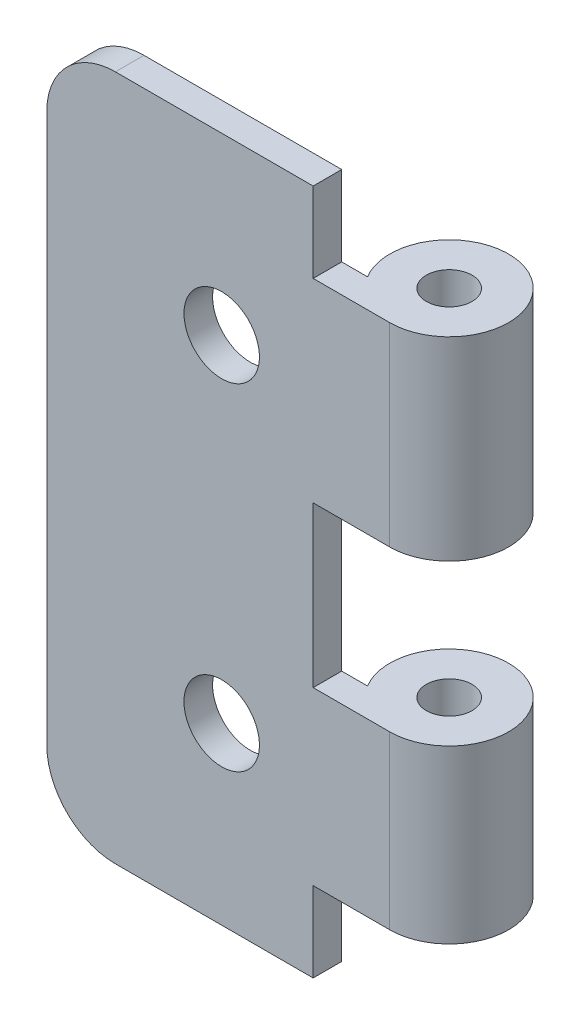
ISO-10303-21;
HEADER;
FILE_DESCRIPTION(('STEP AP214'),'2;1');
FILE_NAME('part.step','',(''),(''),'','','');
FILE_SCHEMA(('AUTOMOTIVE_DESIGN { 1 0 10303 214 1 1 1 1 }'));
ENDSEC;
DATA;
#1=APPLICATION_CONTEXT('core data for automotive mechanical design processes');
#2=APPLICATION_PROTOCOL_DEFINITION('international standard','automotive_design',2000,#1);
#3=PRODUCT_CONTEXT('',#1,'mechanical');
#4=PRODUCT('Part','Part','',(#3));
#5=PRODUCT_RELATED_PRODUCT_CATEGORY('part','',(#4));
#6=PRODUCT_DEFINITION_FORMATION('','',#4);
#7=PRODUCT_DEFINITION_CONTEXT('part definition',#1,'design');
#8=PRODUCT_DEFINITION('design','',#6,#7);
#9=PRODUCT_DEFINITION_SHAPE('','',#8);
#10=(LENGTH_UNIT() NAMED_UNIT(*) SI_UNIT(.MILLI.,.METRE.));
#11=(NAMED_UNIT(*) PLANE_ANGLE_UNIT() SI_UNIT($,.RADIAN.));
#12=(NAMED_UNIT(*) SI_UNIT($,.STERADIAN.) SOLID_ANGLE_UNIT());
#13=UNCERTAINTY_MEASURE_WITH_UNIT(LENGTH_MEASURE(1.E-05),#10,'distance_accuracy_value','');
#14=(GEOMETRIC_REPRESENTATION_CONTEXT(3) GLOBAL_UNCERTAINTY_ASSIGNED_CONTEXT((#13)) GLOBAL_UNIT_ASSIGNED_CONTEXT((#10,
#11,#12)) REPRESENTATION_CONTEXT('',''));
#15=CARTESIAN_POINT('',(0.,0.,0.));
#16=DIRECTION('',(0.,0.,1.));
#17=DIRECTION('',(1.,0.,0.));
#18=AXIS2_PLACEMENT_3D('',#15,#16,#17);
#19=CARTESIAN_POINT('',(7.62,68.58,-2.6658271083128));
#20=DIRECTION('',(0.,0.,1.));
#21=DIRECTION('',(1.,0.,0.));
#22=AXIS2_PLACEMENT_3D('',#19,#20,#21);
#23=CYLINDRICAL_SURFACE('',#22,7.62);
#24=DIRECTION('',(0.,0.,1.));
#25=VECTOR('',#24,1.);
#26=CARTESIAN_POINT('',(7.62,76.2,-2.6658271083128));
#27=LINE('',#26,#25);
#28=CARTESIAN_POINT('',(7.62,76.2,-3.175));
#29=VERTEX_POINT('',#28);
#30=CARTESIAN_POINT('',(7.62,76.2,0.));
#31=VERTEX_POINT('',#30);
#32=EDGE_CURVE('E188',#29,#31,#27,.T.);
#33=ORIENTED_EDGE('',*,*,#32,.F.);
#34=CARTESIAN_POINT('',(7.62,68.58,-3.175));
#35=DIRECTION('',(0.,0.,-1.));
#36=DIRECTION('',(-1.,0.,0.));
#37=AXIS2_PLACEMENT_3D('',#34,#35,#36);
#38=CIRCLE('',#37,7.62);
#39=CARTESIAN_POINT('',(0.,68.58,-3.175));
#40=VERTEX_POINT('',#39);
#41=EDGE_CURVE('E42',#40,#29,#38,.T.);
#42=ORIENTED_EDGE('',*,*,#41,.F.);
#43=DIRECTION('',(0.,0.,1.));
#44=VECTOR('',#43,1.);
#45=CARTESIAN_POINT('',(0.,68.58,-2.6658271083128));
#46=LINE('',#45,#44);
#47=CARTESIAN_POINT('',(0.,68.58,0.));
#48=VERTEX_POINT('',#47);
#49=EDGE_CURVE('E191',#48,#40,#46,.F.);
#50=ORIENTED_EDGE('',*,*,#49,.F.);
#51=CARTESIAN_POINT('',(7.62,68.58,0.));
#52=DIRECTION('',(0.,0.,-1.));
#53=DIRECTION('',(-1.,0.,0.));
#54=AXIS2_PLACEMENT_3D('',#51,#52,#53);
#55=CIRCLE('',#54,7.62);
#56=EDGE_CURVE('E11',#31,#48,#55,.F.);
#57=ORIENTED_EDGE('',*,*,#56,.F.);
#58=EDGE_LOOP('',(#33,#42,#50,#57));
#59=FACE_BOUND('',#58,.T.);
#60=ADVANCED_FACE('F35',(#59),#23,.T.);
#61=CARTESIAN_POINT('',(7.62,7.62,-2.6658271083128));
#62=DIRECTION('',(0.,0.,-1.));
#63=DIRECTION('',(-1.,0.,0.));
#64=AXIS2_PLACEMENT_3D('',#61,#62,#63);
#65=CYLINDRICAL_SURFACE('',#64,7.62);
#66=DIRECTION('',(0.,0.,1.));
#67=VECTOR('',#66,1.);
#68=CARTESIAN_POINT('',(0.,7.62,-2.6658271083128));
#69=LINE('',#68,#67);
#70=CARTESIAN_POINT('',(0.,7.62000000000002,-3.175));
#71=VERTEX_POINT('',#70);
#72=CARTESIAN_POINT('',(0.,7.62000000000002,0.));
#73=VERTEX_POINT('',#72);
#74=EDGE_CURVE('E169',#71,#73,#69,.T.);
#75=ORIENTED_EDGE('',*,*,#74,.F.);
#76=CARTESIAN_POINT('',(7.62,7.62,-3.175));
#77=DIRECTION('',(0.,0.,-1.));
#78=DIRECTION('',(-1.,0.,0.));
#79=AXIS2_PLACEMENT_3D('',#76,#77,#78);
#80=CIRCLE('',#79,7.62);
#81=CARTESIAN_POINT('',(7.62,0.,-3.175));
#82=VERTEX_POINT('',#81);
#83=EDGE_CURVE('E183',#82,#71,#80,.T.);
#84=ORIENTED_EDGE('',*,*,#83,.F.);
#85=DIRECTION('',(0.,0.,1.));
#86=VECTOR('',#85,1.);
#87=CARTESIAN_POINT('',(7.62,0.,-2.6658271083128));
#88=LINE('',#87,#86);
#89=CARTESIAN_POINT('',(7.62,0.,0.));
#90=VERTEX_POINT('',#89);
#91=EDGE_CURVE('E180',#90,#82,#88,.F.);
#92=ORIENTED_EDGE('',*,*,#91,.F.);
#93=CARTESIAN_POINT('',(7.62,7.62,0.));
#94=DIRECTION('',(0.,0.,-1.));
#95=DIRECTION('',(-1.,0.,0.));
#96=AXIS2_PLACEMENT_3D('',#93,#94,#95);
#97=CIRCLE('',#96,7.62);
#98=EDGE_CURVE('E186',#73,#90,#97,.F.);
#99=ORIENTED_EDGE('',*,*,#98,.F.);
#100=EDGE_LOOP('',(#75,#84,#92,#99));
#101=FACE_BOUND('',#100,.T.);
#102=ADVANCED_FACE('F264',(#101),#65,.T.);
#103=CARTESIAN_POINT('',(-13.8136565855366,76.2,0.));
#104=DIRECTION('',(0.,0.,-1.));
#105=DIRECTION('',(-1.,0.,0.));
#106=AXIS2_PLACEMENT_3D('',#103,#104,#105);
#107=PLANE('',#106);
#108=CARTESIAN_POINT('',(19.431,56.769,0.));
#109=DIRECTION('',(0.,0.,-1.));
#110=DIRECTION('',(-1.,0.,0.));
#111=AXIS2_PLACEMENT_3D('',#108,#109,#110);
#112=CIRCLE('',#111,4.191);
#113=CARTESIAN_POINT('',(15.24,56.769,0.));
#114=VERTEX_POINT('',#113);
#115=EDGE_CURVE('E207',#114,#114,#112,.T.);
#116=ORIENTED_EDGE('',*,*,#115,.T.);
#117=EDGE_LOOP('',(#116));
#118=FACE_BOUND('',#117,.T.);
#119=CARTESIAN_POINT('',(19.431,19.431,0.));
#120=DIRECTION('',(0.,0.,-1.));
#121=DIRECTION('',(-1.,0.,0.));
#122=AXIS2_PLACEMENT_3D('',#119,#120,#121);
#123=CIRCLE('',#122,4.191);
#124=CARTESIAN_POINT('',(15.24,19.431,0.));
#125=VERTEX_POINT('',#124);
#126=EDGE_CURVE('E234',#125,#125,#123,.T.);
#127=ORIENTED_EDGE('',*,*,#126,.T.);
#128=EDGE_LOOP('',(#127));
#129=FACE_BOUND('',#128,.T.);
#130=DIRECTION('',(1.,0.,0.));
#131=VECTOR('',#130,1.);
#132=CARTESIAN_POINT('',(-13.8136565855366,76.2,0.));
#133=LINE('',#132,#131);
#134=CARTESIAN_POINT('',(29.591,76.2,0.));
#135=VERTEX_POINT('',#134);
#136=EDGE_CURVE('E199',#31,#135,#133,.T.);
#137=ORIENTED_EDGE('',*,*,#136,.F.);
#138=ORIENTED_EDGE('',*,*,#56,.T.);
#139=DIRECTION('',(0.,-1.,0.));
#140=VECTOR('',#139,1.);
#141=CARTESIAN_POINT('',(0.,76.2,0.));
#142=LINE('',#141,#140);
#143=EDGE_CURVE('E198',#48,#73,#142,.T.);
#144=ORIENTED_EDGE('',*,*,#143,.T.);
#145=ORIENTED_EDGE('',*,*,#98,.T.);
#146=DIRECTION('',(1.,0.,0.));
#147=VECTOR('',#146,1.);
#148=CARTESIAN_POINT('',(-13.8136565855366,0.,0.));
#149=LINE('',#148,#147);
#150=CARTESIAN_POINT('',(29.591,0.,0.));
#151=VERTEX_POINT('',#150);
#152=EDGE_CURVE('E205',#90,#151,#149,.T.);
#153=ORIENTED_EDGE('',*,*,#152,.T.);
#154=DIRECTION('',(0.,-1.,0.));
#155=VECTOR('',#154,1.);
#156=CARTESIAN_POINT('',(29.591,8.89,0.));
#157=LINE('',#156,#155);
#158=CARTESIAN_POINT('',(29.591,8.89,0.));
#159=VERTEX_POINT('',#158);
#160=EDGE_CURVE('E224',#159,#151,#157,.T.);
#161=ORIENTED_EDGE('',*,*,#160,.F.);
#162=DIRECTION('',(1.,0.,0.));
#163=VECTOR('',#162,1.);
#164=CARTESIAN_POINT('',(-13.8136565855366,8.89,0.));
#165=LINE('',#164,#163);
#166=CARTESIAN_POINT('',(38.1,8.89,0.));
#167=VERTEX_POINT('',#166);
#168=EDGE_CURVE('E225',#159,#167,#165,.T.);
#169=ORIENTED_EDGE('',*,*,#168,.T.);
#170=DIRECTION('',(0.,-1.,0.));
#171=VECTOR('',#170,1.);
#172=CARTESIAN_POINT('',(38.1,76.2,0.));
#173=LINE('',#172,#171);
#174=CARTESIAN_POINT('',(38.1,27.94,0.));
#175=VERTEX_POINT('',#174);
#176=EDGE_CURVE('E160',#175,#167,#173,.T.);
#177=ORIENTED_EDGE('',*,*,#176,.F.);
#178=DIRECTION('',(1.,0.,0.));
#179=VECTOR('',#178,1.);
#180=CARTESIAN_POINT('',(-13.8136565855366,27.94,0.));
#181=LINE('',#180,#179);
#182=CARTESIAN_POINT('',(29.591,27.94,0.));
#183=VERTEX_POINT('',#182);
#184=EDGE_CURVE('E327',#183,#175,#181,.T.);
#185=ORIENTED_EDGE('',*,*,#184,.F.);
#186=DIRECTION('',(0.,-1.,0.));
#187=VECTOR('',#186,1.);
#188=CARTESIAN_POINT('',(29.591,45.72,0.));
#189=LINE('',#188,#187);
#190=CARTESIAN_POINT('',(29.591,45.72,0.));
#191=VERTEX_POINT('',#190);
#192=EDGE_CURVE('E334',#191,#183,#189,.T.);
#193=ORIENTED_EDGE('',*,*,#192,.F.);
#194=DIRECTION('',(1.,0.,0.));
#195=VECTOR('',#194,1.);
#196=CARTESIAN_POINT('',(-13.8136565855366,45.72,0.));
#197=LINE('',#196,#195);
#198=CARTESIAN_POINT('',(38.1,45.72,0.));
#199=VERTEX_POINT('',#198);
#200=EDGE_CURVE('E332',#191,#199,#197,.T.);
#201=ORIENTED_EDGE('',*,*,#200,.T.);
#202=CARTESIAN_POINT('',(38.1,67.31,0.));
#203=VERTEX_POINT('',#202);
#204=EDGE_CURVE('E163',#203,#199,#173,.T.);
#205=ORIENTED_EDGE('',*,*,#204,.F.);
#206=DIRECTION('',(1.,0.,0.));
#207=VECTOR('',#206,1.);
#208=CARTESIAN_POINT('',(-13.8136565855366,67.31,0.));
#209=LINE('',#208,#207);
#210=CARTESIAN_POINT('',(29.591,67.31,0.));
#211=VERTEX_POINT('',#210);
#212=EDGE_CURVE('E140',#211,#203,#209,.T.);
#213=ORIENTED_EDGE('',*,*,#212,.F.);
#214=DIRECTION('',(0.,1.,0.));
#215=VECTOR('',#214,1.);
#216=CARTESIAN_POINT('',(29.591,67.31,0.));
#217=LINE('',#216,#215);
#218=EDGE_CURVE('E177',#211,#135,#217,.T.);
#219=ORIENTED_EDGE('',*,*,#218,.T.);
#220=EDGE_LOOP('',(#137,#138,#144,#145,#153,#161,#169,#177,#185,#193,#201,#205,#213,#219));
#221=FACE_BOUND('',#220,.T.);
#222=ADVANCED_FACE('F246',(#118,#129,#221),#107,.F.);
#223=CARTESIAN_POINT('',(38.1,76.2,-6.604));
#224=DIRECTION('',(0.,-1.,0.));
#225=DIRECTION('',(0.,0.,-1.));
#226=AXIS2_PLACEMENT_3D('',#223,#224,#225);
#227=CYLINDRICAL_SURFACE('',#226,6.604);
#228=CARTESIAN_POINT('',(38.1,67.31,-6.604));
#229=DIRECTION('',(0.,1.,0.));
#230=DIRECTION('',(0.,0.,1.));
#231=AXIS2_PLACEMENT_3D('',#228,#229,#230);
#232=CIRCLE('',#231,6.604);
#233=CARTESIAN_POINT('',(32.4559965450046,67.31,-3.175));
#234=VERTEX_POINT('',#233);
#235=EDGE_CURVE('E132',#203,#234,#232,.T.);
#236=ORIENTED_EDGE('',*,*,#235,.F.);
#237=ORIENTED_EDGE('',*,*,#204,.T.);
#238=CARTESIAN_POINT('',(38.1,45.72,-6.604));
#239=DIRECTION('',(0.,1.,0.));
#240=DIRECTION('',(0.,0.,1.));
#241=AXIS2_PLACEMENT_3D('',#238,#239,#240);
#242=CIRCLE('',#241,6.604);
#243=CARTESIAN_POINT('',(32.4559965450046,45.72,-3.175));
#244=VERTEX_POINT('',#243);
#245=EDGE_CURVE('E159',#199,#244,#242,.T.);
#246=ORIENTED_EDGE('',*,*,#245,.T.);
#247=DIRECTION('',(0.,-1.,0.));
#248=VECTOR('',#247,1.);
#249=CARTESIAN_POINT('',(32.4559965450046,76.2,-3.175));
#250=LINE('',#249,#248);
#251=EDGE_CURVE('E150',#234,#244,#250,.T.);
#252=ORIENTED_EDGE('',*,*,#251,.F.);
#253=EDGE_LOOP('',(#236,#237,#246,#252));
#254=FACE_BOUND('',#253,.T.);
#255=ADVANCED_FACE('F157',(#254),#227,.T.);
#256=CARTESIAN_POINT('',(-13.8136565855366,76.2,-3.175));
#257=DIRECTION('',(0.,0.,-1.));
#258=DIRECTION('',(-1.,0.,0.));
#259=AXIS2_PLACEMENT_3D('',#256,#257,#258);
#260=PLANE('',#259);
#261=CARTESIAN_POINT('',(19.431,56.769,-3.175));
#262=DIRECTION('',(0.,0.,-1.));
#263=DIRECTION('',(-1.,0.,0.));
#264=AXIS2_PLACEMENT_3D('',#261,#262,#263);
#265=CIRCLE('',#264,4.191);
#266=CARTESIAN_POINT('',(15.24,56.769,-3.175));
#267=VERTEX_POINT('',#266);
#268=EDGE_CURVE('E241',#267,#267,#265,.T.);
#269=ORIENTED_EDGE('',*,*,#268,.F.);
#270=EDGE_LOOP('',(#269));
#271=FACE_BOUND('',#270,.T.);
#272=CARTESIAN_POINT('',(19.431,19.431,-3.175));
#273=DIRECTION('',(0.,0.,-1.));
#274=DIRECTION('',(-1.,0.,0.));
#275=AXIS2_PLACEMENT_3D('',#272,#273,#274);
#276=CIRCLE('',#275,4.191);
#277=CARTESIAN_POINT('',(15.24,19.431,-3.175));
#278=VERTEX_POINT('',#277);
#279=EDGE_CURVE('E231',#278,#278,#276,.T.);
#280=ORIENTED_EDGE('',*,*,#279,.F.);
#281=EDGE_LOOP('',(#280));
#282=FACE_BOUND('',#281,.T.);
#283=DIRECTION('',(0.,-1.,0.));
#284=VECTOR('',#283,1.);
#285=CARTESIAN_POINT('',(0.,76.2,-3.175));
#286=LINE('',#285,#284);
#287=EDGE_CURVE('E165',#40,#71,#286,.T.);
#288=ORIENTED_EDGE('',*,*,#287,.F.);
#289=ORIENTED_EDGE('',*,*,#41,.T.);
#290=DIRECTION('',(1.,0.,0.));
#291=VECTOR('',#290,1.);
#292=CARTESIAN_POINT('',(-13.8136565855366,76.2,-3.175));
#293=LINE('',#292,#291);
#294=CARTESIAN_POINT('',(29.591,76.2,-3.175));
#295=VERTEX_POINT('',#294);
#296=EDGE_CURVE('E193',#29,#295,#293,.T.);
#297=ORIENTED_EDGE('',*,*,#296,.T.);
#298=DIRECTION('',(0.,1.,0.));
#299=VECTOR('',#298,1.);
#300=CARTESIAN_POINT('',(29.591,67.31,-3.175));
#301=LINE('',#300,#299);
#302=CARTESIAN_POINT('',(29.591,67.31,-3.175));
#303=VERTEX_POINT('',#302);
#304=EDGE_CURVE('E153',#303,#295,#301,.T.);
#305=ORIENTED_EDGE('',*,*,#304,.F.);
#306=DIRECTION('',(1.,0.,0.));
#307=VECTOR('',#306,1.);
#308=CARTESIAN_POINT('',(-13.8136565855366,67.31,-3.175));
#309=LINE('',#308,#307);
#310=EDGE_CURVE('E137',#303,#234,#309,.T.);
#311=ORIENTED_EDGE('',*,*,#310,.T.);
#312=ORIENTED_EDGE('',*,*,#251,.T.);
#313=DIRECTION('',(1.,0.,0.));
#314=VECTOR('',#313,1.);
#315=CARTESIAN_POINT('',(-13.8136565855366,45.72,-3.175));
#316=LINE('',#315,#314);
#317=CARTESIAN_POINT('',(29.591,45.72,-3.175));
#318=VERTEX_POINT('',#317);
#319=EDGE_CURVE('E326',#318,#244,#316,.T.);
#320=ORIENTED_EDGE('',*,*,#319,.F.);
#321=DIRECTION('',(0.,-1.,0.));
#322=VECTOR('',#321,1.);
#323=CARTESIAN_POINT('',(29.591,45.72,-3.175));
#324=LINE('',#323,#322);
#325=CARTESIAN_POINT('',(29.591,27.94,-3.175));
#326=VERTEX_POINT('',#325);
#327=EDGE_CURVE('E226',#318,#326,#324,.T.);
#328=ORIENTED_EDGE('',*,*,#327,.T.);
#329=DIRECTION('',(1.,0.,0.));
#330=VECTOR('',#329,1.);
#331=CARTESIAN_POINT('',(-13.8136565855366,27.94,-3.175));
#332=LINE('',#331,#330);
#333=CARTESIAN_POINT('',(32.4559965450046,27.94,-3.175));
#334=VERTEX_POINT('',#333);
#335=EDGE_CURVE('E319',#326,#334,#332,.T.);
#336=ORIENTED_EDGE('',*,*,#335,.T.);
#337=CARTESIAN_POINT('',(32.4559965450046,8.89,-3.175));
#338=VERTEX_POINT('',#337);
#339=EDGE_CURVE('E161',#334,#338,#250,.T.);
#340=ORIENTED_EDGE('',*,*,#339,.T.);
#341=DIRECTION('',(1.,0.,0.));
#342=VECTOR('',#341,1.);
#343=CARTESIAN_POINT('',(-13.8136565855366,8.89,-3.175));
#344=LINE('',#343,#342);
#345=CARTESIAN_POINT('',(29.591,8.89,-3.175));
#346=VERTEX_POINT('',#345);
#347=EDGE_CURVE('E230',#346,#338,#344,.T.);
#348=ORIENTED_EDGE('',*,*,#347,.F.);
#349=DIRECTION('',(0.,-1.,0.));
#350=VECTOR('',#349,1.);
#351=CARTESIAN_POINT('',(29.591,8.89,-3.175));
#352=LINE('',#351,#350);
#353=CARTESIAN_POINT('',(29.591,0.,-3.175));
#354=VERTEX_POINT('',#353);
#355=EDGE_CURVE('E221',#346,#354,#352,.T.);
#356=ORIENTED_EDGE('',*,*,#355,.T.);
#357=DIRECTION('',(1.,0.,0.));
#358=VECTOR('',#357,1.);
#359=CARTESIAN_POINT('',(-13.8136565855366,0.,-3.175));
#360=LINE('',#359,#358);
#361=EDGE_CURVE('E201',#82,#354,#360,.T.);
#362=ORIENTED_EDGE('',*,*,#361,.F.);
#363=ORIENTED_EDGE('',*,*,#83,.T.);
#364=EDGE_LOOP('',(#288,#289,#297,#305,#311,#312,#320,#328,#336,#340,#348,#356,#362,#363));
#365=FACE_BOUND('',#364,.T.);
#366=ADVANCED_FACE('F148',(#271,#282,#365),#260,.T.);
#367=CARTESIAN_POINT('',(-13.8136565855366,76.2,-2.6658271083128));
#368=DIRECTION('',(0.,1.,0.));
#369=DIRECTION('',(0.,0.,1.));
#370=AXIS2_PLACEMENT_3D('',#367,#368,#369);
#371=PLANE('',#370);
#372=ORIENTED_EDGE('',*,*,#296,.F.);
#373=ORIENTED_EDGE('',*,*,#32,.T.);
#374=ORIENTED_EDGE('',*,*,#136,.T.);
#375=DIRECTION('',(0.,0.,-1.));
#376=VECTOR('',#375,1.);
#377=CARTESIAN_POINT('',(29.591,76.2,-2.6658271083128));
#378=LINE('',#377,#376);
#379=EDGE_CURVE('E144',#135,#295,#378,.T.);
#380=ORIENTED_EDGE('',*,*,#379,.T.);
#381=EDGE_LOOP('',(#372,#373,#374,#380));
#382=FACE_BOUND('',#381,.T.);
#383=ADVANCED_FACE('F196',(#382),#371,.T.);
#384=CARTESIAN_POINT('',(38.1,0.,-6.604));
#385=DIRECTION('',(0.,1.,0.));
#386=DIRECTION('',(0.,0.,1.));
#387=AXIS2_PLACEMENT_3D('',#384,#385,#386);
#388=CYLINDRICAL_SURFACE('',#387,2.54);
#389=CARTESIAN_POINT('',(38.1,45.72,-6.604));
#390=DIRECTION('',(0.,1.,0.));
#391=DIRECTION('',(0.,0.,1.));
#392=AXIS2_PLACEMENT_3D('',#389,#390,#391);
#393=CIRCLE('',#392,2.54);
#394=CARTESIAN_POINT('',(38.1,45.72,-4.064));
#395=VERTEX_POINT('',#394);
#396=EDGE_CURVE('E173',#395,#395,#393,.T.);
#397=CARTESIAN_POINT('',(38.1,67.31,-6.604));
#398=DIRECTION('',(0.,1.,0.));
#399=DIRECTION('',(0.,0.,1.));
#400=AXIS2_PLACEMENT_3D('',#397,#398,#399);
#401=CIRCLE('',#400,2.54);
#402=CARTESIAN_POINT('',(38.1,67.31,-4.064));
#403=VERTEX_POINT('',#402);
#404=EDGE_CURVE('E174',#403,#403,#401,.F.);
#405=CARTESIAN_POINT('',(38.1,45.72,-4.064));
#406=CARTESIAN_POINT('',(38.1,45.9448958333333,-4.064));
#407=CARTESIAN_POINT('',(38.1,46.1697916666667,-4.064));
#408=CARTESIAN_POINT('',(38.1,46.6195833333333,-4.064));
#409=CARTESIAN_POINT('',(38.1,46.8444791666667,-4.064));
#410=CARTESIAN_POINT('',(38.1,47.2942708333333,-4.064));
#411=CARTESIAN_POINT('',(38.1,47.5191666666667,-4.064));
#412=CARTESIAN_POINT('',(38.1,47.9689583333333,-4.064));
#413=CARTESIAN_POINT('',(38.1,48.1938541666667,-4.064));
#414=CARTESIAN_POINT('',(38.1,48.6436458333333,-4.064));
#415=CARTESIAN_POINT('',(38.1,48.8685416666667,-4.064));
#416=CARTESIAN_POINT('',(38.1,49.3183333333333,-4.064));
#417=CARTESIAN_POINT('',(38.1,49.5432291666667,-4.064));
#418=CARTESIAN_POINT('',(38.1,49.9930208333333,-4.064));
#419=CARTESIAN_POINT('',(38.1,50.2179166666667,-4.064));
#420=CARTESIAN_POINT('',(38.1,50.6677083333333,-4.064));
#421=CARTESIAN_POINT('',(38.1,50.8926041666667,-4.064));
#422=CARTESIAN_POINT('',(38.1,51.3423958333333,-4.064));
#423=CARTESIAN_POINT('',(38.1,51.5672916666667,-4.064));
#424=CARTESIAN_POINT('',(38.1,52.0170833333333,-4.064));
#425=CARTESIAN_POINT('',(38.1,52.2419791666667,-4.064));
#426=CARTESIAN_POINT('',(38.1,52.6917708333333,-4.064));
#427=CARTESIAN_POINT('',(38.1,52.9166666666667,-4.064));
#428=CARTESIAN_POINT('',(38.1,53.3664583333333,-4.064));
#429=CARTESIAN_POINT('',(38.1,53.5913541666667,-4.064));
#430=CARTESIAN_POINT('',(38.1,54.0411458333333,-4.064));
#431=CARTESIAN_POINT('',(38.1,54.2660416666667,-4.064));
#432=CARTESIAN_POINT('',(38.1,54.7158333333333,-4.064));
#433=CARTESIAN_POINT('',(38.1,54.9407291666667,-4.064));
#434=CARTESIAN_POINT('',(38.1,55.3905208333333,-4.064));
#435=CARTESIAN_POINT('',(38.1,55.6154166666667,-4.064));
#436=CARTESIAN_POINT('',(38.1,56.0652083333333,-4.064));
#437=CARTESIAN_POINT('',(38.1,56.2901041666667,-4.064));
#438=CARTESIAN_POINT('',(38.1,56.7398958333333,-4.064));
#439=CARTESIAN_POINT('',(38.1,56.9647916666667,-4.064));
#440=CARTESIAN_POINT('',(38.1,57.4145833333333,-4.064));
#441=CARTESIAN_POINT('',(38.1,57.6394791666667,-4.064));
#442=CARTESIAN_POINT('',(38.1,58.0892708333333,-4.064));
#443=CARTESIAN_POINT('',(38.1,58.3141666666667,-4.064));
#444=CARTESIAN_POINT('',(38.1,58.7639583333333,-4.064));
#445=CARTESIAN_POINT('',(38.1,58.9888541666667,-4.064));
#446=CARTESIAN_POINT('',(38.1,59.4386458333333,-4.064));
#447=CARTESIAN_POINT('',(38.1,59.6635416666667,-4.064));
#448=CARTESIAN_POINT('',(38.1,60.1133333333333,-4.064));
#449=CARTESIAN_POINT('',(38.1,60.3382291666667,-4.064));
#450=CARTESIAN_POINT('',(38.1,60.7880208333333,-4.064));
#451=CARTESIAN_POINT('',(38.1,61.0129166666667,-4.064));
#452=CARTESIAN_POINT('',(38.1,61.4627083333333,-4.064));
#453=CARTESIAN_POINT('',(38.1,61.6876041666667,-4.064));
#454=CARTESIAN_POINT('',(38.1,62.1373958333333,-4.064));
#455=CARTESIAN_POINT('',(38.1,62.3622916666667,-4.064));
#456=CARTESIAN_POINT('',(38.1,62.8120833333333,-4.064));
#457=CARTESIAN_POINT('',(38.1,63.0369791666667,-4.064));
#458=CARTESIAN_POINT('',(38.1,63.4867708333333,-4.064));
#459=CARTESIAN_POINT('',(38.1,63.7116666666667,-4.064));
#460=CARTESIAN_POINT('',(38.1,64.1614583333333,-4.064));
#461=CARTESIAN_POINT('',(38.1,64.3863541666667,-4.064));
#462=CARTESIAN_POINT('',(38.1,64.8361458333333,-4.064));
#463=CARTESIAN_POINT('',(38.1,65.0610416666667,-4.064));
#464=CARTESIAN_POINT('',(38.1,65.5108333333333,-4.064));
#465=CARTESIAN_POINT('',(38.1,65.7357291666667,-4.064));
#466=CARTESIAN_POINT('',(38.1,66.1855208333333,-4.064));
#467=CARTESIAN_POINT('',(38.1,66.4104166666667,-4.064));
#468=CARTESIAN_POINT('',(38.1,66.8602083333333,-4.064));
#469=CARTESIAN_POINT('',(38.1,67.0851041666667,-4.064));
#470=CARTESIAN_POINT('',(38.1,67.31,-4.064));
#471=B_SPLINE_CURVE_WITH_KNOTS('',3,(#405,#406,#407,#408,#409,#410,#411,#412,#413,#414,#415,
#416,#417,#418,#419,#420,#421,#422,#423,#424,#425,#426,#427,#428,#429,#430,#431,#432,#433,#434,
#435,#436,#437,#438,#439,#440,#441,#442,#443,#444,#445,#446,#447,#448,#449,#450,#451,#452,#453,
#454,#455,#456,#457,#458,#459,#460,#461,#462,#463,#464,#465,#466,#467,#468,#469,#470),
.UNSPECIFIED.,.F.,.F.,(4,2,2,2,2,2,2,2,2,2,2,2,2,2,2,2,2,2,2,2,2,2,2,2,2,2,2,2,2,2,2,2,4),(0.,
0.6746875,1.349375,2.0240625,2.69875,3.3734375,4.048125,4.72281250000001,5.3975,
6.07218750000001,6.74687500000001,7.42156250000001,8.09625000000001,8.77093750000001,
9.44562500000001,10.1203125,10.795,11.4696875,12.144375,12.8190625,13.49375,14.1684375,
14.843125,15.5178125,16.1925,16.8671875,17.541875,18.2165625,18.89125,19.5659375,20.240625,
20.9153125,21.59),.UNSPECIFIED.);
#472=EDGE_CURVE('BSEAM284',#395,#403,#471,.T.);
#473=ORIENTED_EDGE('',*,*,#396,.F.);
#474=ORIENTED_EDGE('',*,*,#404,.F.);
#475=ORIENTED_EDGE('',*,*,#472,.T.);
#476=ORIENTED_EDGE('',*,*,#472,.F.);
#477=EDGE_LOOP('',(#473,#475,#474,#476));
#478=FACE_BOUND('',#477,.T.);
#479=ADVANCED_FACE('F284',(#478),#388,.F.);
#480=CARTESIAN_POINT('',(38.1,27.94,-6.604));
#481=DIRECTION('',(0.,1.,0.));
#482=DIRECTION('',(0.,0.,1.));
#483=AXIS2_PLACEMENT_3D('',#480,#481,#482);
#484=CIRCLE('',#483,6.604);
#485=EDGE_CURVE('E317',#175,#334,#484,.T.);
#486=ORIENTED_EDGE('',*,*,#485,.F.);
#487=ORIENTED_EDGE('',*,*,#176,.T.);
#488=CARTESIAN_POINT('',(38.1,8.89,-6.604));
#489=DIRECTION('',(0.,1.,0.));
#490=DIRECTION('',(0.,0.,1.));
#491=AXIS2_PLACEMENT_3D('',#488,#489,#490);
#492=CIRCLE('',#491,6.604);
#493=EDGE_CURVE('E347',#167,#338,#492,.T.);
#494=ORIENTED_EDGE('',*,*,#493,.T.);
#495=ORIENTED_EDGE('',*,*,#339,.F.);
#496=EDGE_LOOP('',(#486,#487,#494,#495));
#497=FACE_BOUND('',#496,.T.);
#498=ADVANCED_FACE('F277',(#497),#227,.T.);
#499=CARTESIAN_POINT('',(0.,76.2,-2.6658271083128));
#500=DIRECTION('',(-1.,0.,0.));
#501=DIRECTION('',(0.,0.,1.));
#502=AXIS2_PLACEMENT_3D('',#499,#500,#501);
#503=PLANE('',#502);
#504=ORIENTED_EDGE('',*,*,#143,.F.);
#505=ORIENTED_EDGE('',*,*,#49,.T.);
#506=ORIENTED_EDGE('',*,*,#287,.T.);
#507=ORIENTED_EDGE('',*,*,#74,.T.);
#508=EDGE_LOOP('',(#504,#505,#506,#507));
#509=FACE_BOUND('',#508,.T.);
#510=ADVANCED_FACE('F260',(#509),#503,.T.);
#511=CARTESIAN_POINT('',(-13.8136565855366,0.,-2.6658271083128));
#512=DIRECTION('',(0.,1.,0.));
#513=DIRECTION('',(0.,0.,1.));
#514=AXIS2_PLACEMENT_3D('',#511,#512,#513);
#515=PLANE('',#514);
#516=ORIENTED_EDGE('',*,*,#152,.F.);
#517=ORIENTED_EDGE('',*,*,#91,.T.);
#518=ORIENTED_EDGE('',*,*,#361,.T.);
#519=DIRECTION('',(0.,0.,-1.));
#520=VECTOR('',#519,1.);
#521=CARTESIAN_POINT('',(29.591,0.,-2.6658271083128));
#522=LINE('',#521,#520);
#523=EDGE_CURVE('E214',#151,#354,#522,.T.);
#524=ORIENTED_EDGE('',*,*,#523,.F.);
#525=EDGE_LOOP('',(#516,#517,#518,#524));
#526=FACE_BOUND('',#525,.T.);
#527=ADVANCED_FACE('F213',(#526),#515,.F.);
#528=CARTESIAN_POINT('',(19.431,56.769,47.625));
#529=DIRECTION('',(0.,0.,-1.));
#530=DIRECTION('',(-1.,0.,0.));
#531=AXIS2_PLACEMENT_3D('',#528,#529,#530);
#532=CYLINDRICAL_SURFACE('',#531,4.191);
#533=ORIENTED_EDGE('',*,*,#268,.T.);
#534=EDGE_LOOP('',(#533));
#535=FACE_BOUND('',#534,.T.);
#536=ORIENTED_EDGE('',*,*,#115,.F.);
#537=EDGE_LOOP('',(#536));
#538=FACE_BOUND('',#537,.T.);
#539=ADVANCED_FACE('F249',(#535,#538),#532,.F.);
#540=CARTESIAN_POINT('',(19.431,19.431,47.625));
#541=DIRECTION('',(0.,0.,-1.));
#542=DIRECTION('',(-1.,0.,0.));
#543=AXIS2_PLACEMENT_3D('',#540,#541,#542);
#544=CYLINDRICAL_SURFACE('',#543,4.191);
#545=ORIENTED_EDGE('',*,*,#279,.T.);
#546=EDGE_LOOP('',(#545));
#547=FACE_BOUND('',#546,.T.);
#548=ORIENTED_EDGE('',*,*,#126,.F.);
#549=EDGE_LOOP('',(#548));
#550=FACE_BOUND('',#549,.T.);
#551=ADVANCED_FACE('F251',(#547,#550),#544,.F.);
#552=CARTESIAN_POINT('',(29.591,8.89,-2.6658271083128));
#553=DIRECTION('',(-1.,0.,0.));
#554=DIRECTION('',(0.,0.,1.));
#555=AXIS2_PLACEMENT_3D('',#552,#553,#554);
#556=PLANE('',#555);
#557=ORIENTED_EDGE('',*,*,#523,.T.);
#558=ORIENTED_EDGE('',*,*,#355,.F.);
#559=DIRECTION('',(0.,0.,-1.));
#560=VECTOR('',#559,1.);
#561=CARTESIAN_POINT('',(29.591,8.89,-2.6658271083128));
#562=LINE('',#561,#560);
#563=EDGE_CURVE('E236',#159,#346,#562,.T.);
#564=ORIENTED_EDGE('',*,*,#563,.F.);
#565=ORIENTED_EDGE('',*,*,#160,.T.);
#566=EDGE_LOOP('',(#557,#558,#564,#565));
#567=FACE_BOUND('',#566,.T.);
#568=ADVANCED_FACE('F219',(#567),#556,.F.);
#569=CARTESIAN_POINT('',(-13.8136565855366,8.89,-2.6658271083128));
#570=DIRECTION('',(0.,1.,0.));
#571=DIRECTION('',(0.,0.,1.));
#572=AXIS2_PLACEMENT_3D('',#569,#570,#571);
#573=PLANE('',#572);
#574=CARTESIAN_POINT('',(38.1,8.89,-6.604));
#575=DIRECTION('',(0.,1.,0.));
#576=DIRECTION('',(0.,0.,1.));
#577=AXIS2_PLACEMENT_3D('',#574,#575,#576);
#578=CIRCLE('',#577,2.54);
#579=CARTESIAN_POINT('',(38.1,8.89,-4.064));
#580=VERTEX_POINT('',#579);
#581=EDGE_CURVE('E315',#580,#580,#578,.T.);
#582=ORIENTED_EDGE('',*,*,#581,.T.);
#583=EDGE_LOOP('',(#582));
#584=FACE_BOUND('',#583,.T.);
#585=ORIENTED_EDGE('',*,*,#168,.F.);
#586=ORIENTED_EDGE('',*,*,#563,.T.);
#587=ORIENTED_EDGE('',*,*,#347,.T.);
#588=ORIENTED_EDGE('',*,*,#493,.F.);
#589=EDGE_LOOP('',(#585,#586,#587,#588));
#590=FACE_BOUND('',#589,.T.);
#591=ADVANCED_FACE('F352',(#584,#590),#573,.F.);
#592=CARTESIAN_POINT('',(29.591,45.72,-2.6658271083128));
#593=DIRECTION('',(-1.,0.,0.));
#594=DIRECTION('',(0.,0.,1.));
#595=AXIS2_PLACEMENT_3D('',#592,#593,#594);
#596=PLANE('',#595);
#597=DIRECTION('',(0.,0.,-1.));
#598=VECTOR('',#597,1.);
#599=CARTESIAN_POINT('',(29.591,27.94,-2.6658271083128));
#600=LINE('',#599,#598);
#601=EDGE_CURVE('E338',#183,#326,#600,.T.);
#602=ORIENTED_EDGE('',*,*,#601,.T.);
#603=ORIENTED_EDGE('',*,*,#327,.F.);
#604=DIRECTION('',(0.,0.,-1.));
#605=VECTOR('',#604,1.);
#606=CARTESIAN_POINT('',(29.591,45.72,-2.6658271083128));
#607=LINE('',#606,#605);
#608=EDGE_CURVE('E329',#191,#318,#607,.T.);
#609=ORIENTED_EDGE('',*,*,#608,.F.);
#610=ORIENTED_EDGE('',*,*,#192,.T.);
#611=EDGE_LOOP('',(#602,#603,#609,#610));
#612=FACE_BOUND('',#611,.T.);
#613=ADVANCED_FACE('F365',(#612),#596,.F.);
#614=CARTESIAN_POINT('',(-13.8136565855366,45.72,-2.6658271083128));
#615=DIRECTION('',(0.,1.,0.));
#616=DIRECTION('',(0.,0.,1.));
#617=AXIS2_PLACEMENT_3D('',#614,#615,#616);
#618=PLANE('',#617);
#619=ORIENTED_EDGE('',*,*,#396,.T.);
#620=EDGE_LOOP('',(#619));
#621=FACE_BOUND('',#620,.T.);
#622=ORIENTED_EDGE('',*,*,#245,.F.);
#623=ORIENTED_EDGE('',*,*,#200,.F.);
#624=ORIENTED_EDGE('',*,*,#608,.T.);
#625=ORIENTED_EDGE('',*,*,#319,.T.);
#626=EDGE_LOOP('',(#622,#623,#624,#625));
#627=FACE_BOUND('',#626,.T.);
#628=ADVANCED_FACE('F308',(#621,#627),#618,.F.);
#629=CARTESIAN_POINT('',(-13.8136565855366,27.94,-2.6658271083128));
#630=DIRECTION('',(0.,1.,0.));
#631=DIRECTION('',(0.,0.,1.));
#632=AXIS2_PLACEMENT_3D('',#629,#630,#631);
#633=PLANE('',#632);
#634=CARTESIAN_POINT('',(38.1,27.94,-6.604));
#635=DIRECTION('',(0.,1.,0.));
#636=DIRECTION('',(0.,0.,1.));
#637=AXIS2_PLACEMENT_3D('',#634,#635,#636);
#638=CIRCLE('',#637,2.54);
#639=CARTESIAN_POINT('',(38.1,27.94,-4.064));
#640=VERTEX_POINT('',#639);
#641=EDGE_CURVE('E170',#640,#640,#638,.T.);
#642=ORIENTED_EDGE('',*,*,#641,.F.);
#643=EDGE_LOOP('',(#642));
#644=FACE_BOUND('',#643,.T.);
#645=ORIENTED_EDGE('',*,*,#485,.T.);
#646=ORIENTED_EDGE('',*,*,#335,.F.);
#647=ORIENTED_EDGE('',*,*,#601,.F.);
#648=ORIENTED_EDGE('',*,*,#184,.T.);
#649=EDGE_LOOP('',(#645,#646,#647,#648));
#650=FACE_BOUND('',#649,.T.);
#651=ADVANCED_FACE('F300',(#644,#650),#633,.T.);
#652=CARTESIAN_POINT('',(38.1,27.94,-4.064));
#653=CARTESIAN_POINT('',(38.1,27.7415625,-4.064));
#654=CARTESIAN_POINT('',(38.1,27.543125,-4.064));
#655=CARTESIAN_POINT('',(38.1,27.14625,-4.064));
#656=CARTESIAN_POINT('',(38.1,26.9478125,-4.064));
#657=CARTESIAN_POINT('',(38.1,26.5509375,-4.064));
#658=CARTESIAN_POINT('',(38.1,26.3525,-4.064));
#659=CARTESIAN_POINT('',(38.1,25.955625,-4.064));
#660=CARTESIAN_POINT('',(38.1,25.7571875,-4.064));
#661=CARTESIAN_POINT('',(38.1,25.3603125,-4.064));
#662=CARTESIAN_POINT('',(38.1,25.161875,-4.064));
#663=CARTESIAN_POINT('',(38.1,24.765,-4.064));
#664=CARTESIAN_POINT('',(38.1,24.5665625,-4.064));
#665=CARTESIAN_POINT('',(38.1,24.1696875,-4.064));
#666=CARTESIAN_POINT('',(38.1,23.97125,-4.064));
#667=CARTESIAN_POINT('',(38.1,23.574375,-4.064));
#668=CARTESIAN_POINT('',(38.1,23.3759375,-4.064));
#669=CARTESIAN_POINT('',(38.1,22.9790625,-4.064));
#670=CARTESIAN_POINT('',(38.1,22.780625,-4.064));
#671=CARTESIAN_POINT('',(38.1,22.38375,-4.064));
#672=CARTESIAN_POINT('',(38.1,22.1853125,-4.064));
#673=CARTESIAN_POINT('',(38.1,21.7884375,-4.064));
#674=CARTESIAN_POINT('',(38.1,21.59,-4.064));
#675=CARTESIAN_POINT('',(38.1,21.193125,-4.064));
#676=CARTESIAN_POINT('',(38.1,20.9946875,-4.064));
#677=CARTESIAN_POINT('',(38.1,20.5978125,-4.064));
#678=CARTESIAN_POINT('',(38.1,20.399375,-4.064));
#679=CARTESIAN_POINT('',(38.1,20.0025,-4.064));
#680=CARTESIAN_POINT('',(38.1,19.8040625,-4.064));
#681=CARTESIAN_POINT('',(38.1,19.4071875,-4.064));
#682=CARTESIAN_POINT('',(38.1,19.20875,-4.064));
#683=CARTESIAN_POINT('',(38.1,18.811875,-4.064));
#684=CARTESIAN_POINT('',(38.1,18.6134375,-4.064));
#685=CARTESIAN_POINT('',(38.1,18.2165625,-4.064));
#686=CARTESIAN_POINT('',(38.1,18.018125,-4.064));
#687=CARTESIAN_POINT('',(38.1,17.62125,-4.064));
#688=CARTESIAN_POINT('',(38.1,17.4228125,-4.064));
#689=CARTESIAN_POINT('',(38.1,17.0259375,-4.064));
#690=CARTESIAN_POINT('',(38.1,16.8275,-4.064));
#691=CARTESIAN_POINT('',(38.1,16.430625,-4.064));
#692=CARTESIAN_POINT('',(38.1,16.2321875,-4.064));
#693=CARTESIAN_POINT('',(38.1,15.8353125,-4.064));
#694=CARTESIAN_POINT('',(38.1,15.636875,-4.064));
#695=CARTESIAN_POINT('',(38.1,15.24,-4.064));
#696=CARTESIAN_POINT('',(38.1,15.0415625,-4.064));
#697=CARTESIAN_POINT('',(38.1,14.6446875,-4.064));
#698=CARTESIAN_POINT('',(38.1,14.44625,-4.064));
#699=CARTESIAN_POINT('',(38.1,14.049375,-4.064));
#700=CARTESIAN_POINT('',(38.1,13.8509375,-4.064));
#701=CARTESIAN_POINT('',(38.1,13.4540625,-4.064));
#702=CARTESIAN_POINT('',(38.1,13.255625,-4.064));
#703=CARTESIAN_POINT('',(38.1,12.85875,-4.064));
#704=CARTESIAN_POINT('',(38.1,12.6603125,-4.064));
#705=CARTESIAN_POINT('',(38.1,12.2634375,-4.064));
#706=CARTESIAN_POINT('',(38.1,12.065,-4.064));
#707=CARTESIAN_POINT('',(38.1,11.668125,-4.064));
#708=CARTESIAN_POINT('',(38.1,11.4696875,-4.064));
#709=CARTESIAN_POINT('',(38.1,11.0728125,-4.064));
#710=CARTESIAN_POINT('',(38.1,10.874375,-4.064));
#711=CARTESIAN_POINT('',(38.1,10.4775,-4.064));
#712=CARTESIAN_POINT('',(38.1,10.2790625,-4.064));
#713=CARTESIAN_POINT('',(38.1,9.8821875,-4.064));
#714=CARTESIAN_POINT('',(38.1,9.68375,-4.064));
#715=CARTESIAN_POINT('',(38.1,9.286875,-4.064));
#716=CARTESIAN_POINT('',(38.1,9.0884375,-4.064));
#717=CARTESIAN_POINT('',(38.1,8.89,-4.064));
#718=B_SPLINE_CURVE_WITH_KNOTS('',3,(#652,#653,#654,#655,#656,#657,#658,#659,#660,#661,#662,
#663,#664,#665,#666,#667,#668,#669,#670,#671,#672,#673,#674,#675,#676,#677,#678,#679,#680,#681,
#682,#683,#684,#685,#686,#687,#688,#689,#690,#691,#692,#693,#694,#695,#696,#697,#698,#699,#700,
#701,#702,#703,#704,#705,#706,#707,#708,#709,#710,#711,#712,#713,#714,#715,#716,#717),
.UNSPECIFIED.,.F.,.F.,(4,2,2,2,2,2,2,2,2,2,2,2,2,2,2,2,2,2,2,2,2,2,2,2,2,2,2,2,2,2,2,2,4),(0.,
0.5953125,1.190625,1.7859375,2.38125,2.9765625,3.571875,4.1671875,4.7625,5.3578125,5.953125,
6.5484375,7.14375,7.7390625,8.334375,8.92968750000001,9.52500000000001,10.1203125,10.715625,
11.3109375,11.90625,12.5015625,13.096875,13.6921875,14.2875,14.8828125,15.478125,16.0734375,
16.66875,17.2640625,17.859375,18.4546875,19.05),.UNSPECIFIED.);
#719=EDGE_CURVE('BSEAM290',#640,#580,#718,.T.);
#720=ORIENTED_EDGE('',*,*,#641,.T.);
#721=ORIENTED_EDGE('',*,*,#581,.F.);
#722=ORIENTED_EDGE('',*,*,#719,.T.);
#723=ORIENTED_EDGE('',*,*,#719,.F.);
#724=EDGE_LOOP('',(#720,#722,#721,#723));
#725=FACE_BOUND('',#724,.T.);
#726=ADVANCED_FACE('F290',(#725),#388,.F.);
#727=CARTESIAN_POINT('',(-13.8136565855366,67.31,-2.6658271083128));
#728=DIRECTION('',(0.,1.,0.));
#729=DIRECTION('',(0.,0.,1.));
#730=AXIS2_PLACEMENT_3D('',#727,#728,#729);
#731=PLANE('',#730);
#732=ORIENTED_EDGE('',*,*,#235,.T.);
#733=ORIENTED_EDGE('',*,*,#310,.F.);
#734=DIRECTION('',(0.,0.,-1.));
#735=VECTOR('',#734,1.);
#736=CARTESIAN_POINT('',(29.591,67.31,-2.6658271083128));
#737=LINE('',#736,#735);
#738=EDGE_CURVE('E154',#211,#303,#737,.T.);
#739=ORIENTED_EDGE('',*,*,#738,.F.);
#740=ORIENTED_EDGE('',*,*,#212,.T.);
#741=EDGE_LOOP('',(#732,#733,#739,#740));
#742=FACE_BOUND('',#741,.T.);
#743=ORIENTED_EDGE('',*,*,#404,.T.);
#744=EDGE_LOOP('',(#743));
#745=FACE_BOUND('',#744,.T.);
#746=ADVANCED_FACE('F134',(#742,#745),#731,.T.);
#747=CARTESIAN_POINT('',(29.591,67.31,-2.6658271083128));
#748=DIRECTION('',(1.,0.,0.));
#749=DIRECTION('',(0.,0.,-1.));
#750=AXIS2_PLACEMENT_3D('',#747,#748,#749);
#751=PLANE('',#750);
#752=ORIENTED_EDGE('',*,*,#379,.F.);
#753=ORIENTED_EDGE('',*,*,#218,.F.);
#754=ORIENTED_EDGE('',*,*,#738,.T.);
#755=ORIENTED_EDGE('',*,*,#304,.T.);
#756=EDGE_LOOP('',(#752,#753,#754,#755));
#757=FACE_BOUND('',#756,.T.);
#758=ADVANCED_FACE('F306',(#757),#751,.T.);
#759=CLOSED_SHELL('',(#60,#102,#222,#255,#366,#383,#479,#498,#510,#527,#539,#551,#568,#591,#613,
#628,#651,#726,#746,#758));
#760=MANIFOLD_SOLID_BREP('B2',#759);
#761=ADVANCED_BREP_SHAPE_REPRESENTATION('',(#18,#760),#14);
#762=SHAPE_DEFINITION_REPRESENTATION(#9,#761);
ENDSEC;
END-ISO-10303-21;
